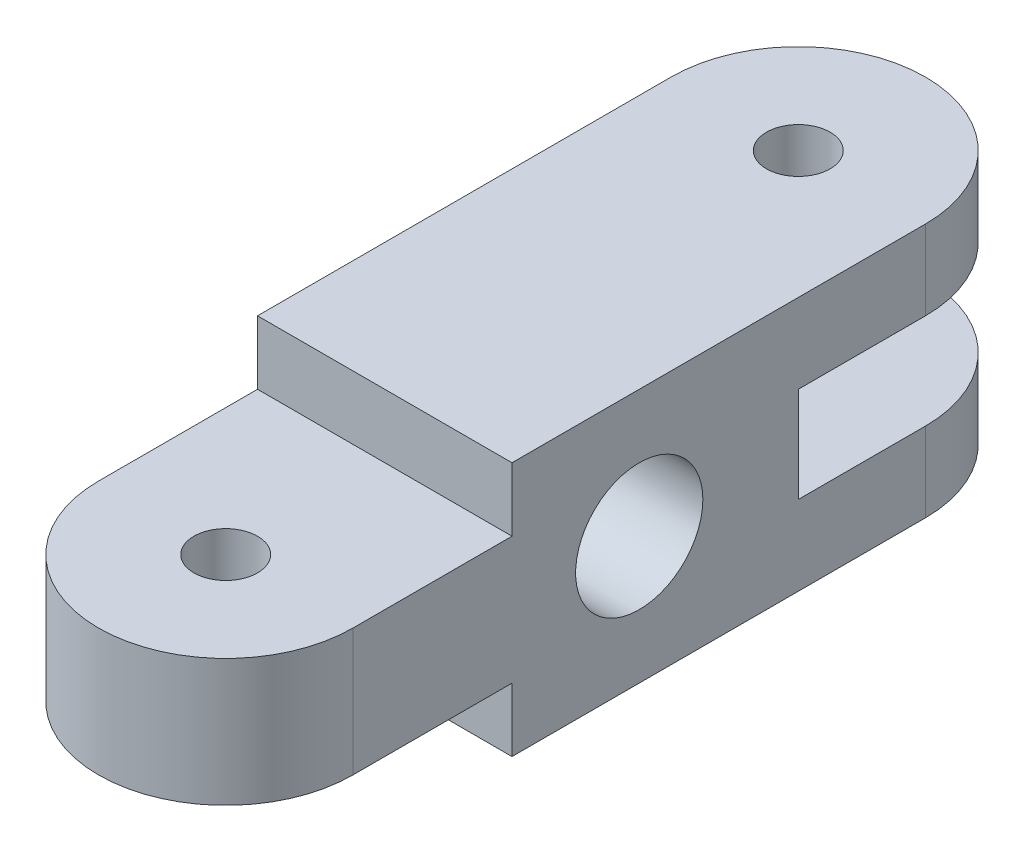
ISO-10303-21;
HEADER;
FILE_DESCRIPTION(('STEP AP214'),'2;1');
FILE_NAME('part.step','',(''),(''),'','','');
FILE_SCHEMA(('AUTOMOTIVE_DESIGN { 1 0 10303 214 1 1 1 1 }'));
ENDSEC;
DATA;
#1=APPLICATION_CONTEXT('core data for automotive mechanical design processes');
#2=APPLICATION_PROTOCOL_DEFINITION('international standard','automotive_design',2000,#1);
#3=PRODUCT_CONTEXT('',#1,'mechanical');
#4=PRODUCT('Part','Part','',(#3));
#5=PRODUCT_RELATED_PRODUCT_CATEGORY('part','',(#4));
#6=PRODUCT_DEFINITION_FORMATION('','',#4);
#7=PRODUCT_DEFINITION_CONTEXT('part definition',#1,'design');
#8=PRODUCT_DEFINITION('design','',#6,#7);
#9=PRODUCT_DEFINITION_SHAPE('','',#8);
#10=(LENGTH_UNIT() NAMED_UNIT(*) SI_UNIT(.MILLI.,.METRE.));
#11=(NAMED_UNIT(*) PLANE_ANGLE_UNIT() SI_UNIT($,.RADIAN.));
#12=(NAMED_UNIT(*) SI_UNIT($,.STERADIAN.) SOLID_ANGLE_UNIT());
#13=UNCERTAINTY_MEASURE_WITH_UNIT(LENGTH_MEASURE(1.E-05),#10,'distance_accuracy_value','');
#14=(GEOMETRIC_REPRESENTATION_CONTEXT(3) GLOBAL_UNCERTAINTY_ASSIGNED_CONTEXT((#13)) GLOBAL_UNIT_ASSIGNED_CONTEXT((#10,
#11,#12)) REPRESENTATION_CONTEXT('',''));
#15=CARTESIAN_POINT('',(0.,0.,0.));
#16=DIRECTION('',(0.,0.,1.));
#17=DIRECTION('',(1.,0.,0.));
#18=AXIS2_PLACEMENT_3D('',#15,#16,#17);
#19=CARTESIAN_POINT('',(12.7,-12.7,41.275));
#20=DIRECTION('',(-1.,0.,0.));
#21=DIRECTION('',(0.,0.,1.));
#22=AXIS2_PLACEMENT_3D('',#19,#20,#21);
#23=PLANE('',#22);
#24=CARTESIAN_POINT('',(12.7,0.,0.));
#25=DIRECTION('',(1.,0.,0.));
#26=DIRECTION('',(0.,0.,-1.));
#27=AXIS2_PLACEMENT_3D('',#24,#25,#26);
#28=CIRCLE('',#27,6.35);
#29=CARTESIAN_POINT('',(12.7,0.,-6.35));
#30=VERTEX_POINT('',#29);
#31=EDGE_CURVE('E158',#30,#30,#28,.T.);
#32=ORIENTED_EDGE('',*,*,#31,.F.);
#33=EDGE_LOOP('',(#32));
#34=FACE_BOUND('',#33,.T.);
#35=DIRECTION('',(0.,0.,-1.));
#36=VECTOR('',#35,1.);
#37=CARTESIAN_POINT('',(12.7,6.35,41.275));
#38=LINE('',#37,#36);
#39=CARTESIAN_POINT('',(12.7,6.35,28.575));
#40=VERTEX_POINT('',#39);
#41=CARTESIAN_POINT('',(12.7,6.35,12.7));
#42=VERTEX_POINT('',#41);
#43=EDGE_CURVE('E180',#40,#42,#38,.T.);
#44=ORIENTED_EDGE('',*,*,#43,.F.);
#45=DIRECTION('',(0.,1.,0.));
#46=VECTOR('',#45,1.);
#47=CARTESIAN_POINT('',(12.7,-12.7,28.575));
#48=LINE('',#47,#46);
#49=CARTESIAN_POINT('',(12.7,-6.35,28.575));
#50=VERTEX_POINT('',#49);
#51=EDGE_CURVE('E60',#50,#40,#48,.T.);
#52=ORIENTED_EDGE('',*,*,#51,.F.);
#53=DIRECTION('',(0.,0.,1.));
#54=VECTOR('',#53,1.);
#55=CARTESIAN_POINT('',(12.7,-6.35,41.275));
#56=LINE('',#55,#54);
#57=CARTESIAN_POINT('',(12.7,-6.35,12.7));
#58=VERTEX_POINT('',#57);
#59=EDGE_CURVE('E206',#58,#50,#56,.T.);
#60=ORIENTED_EDGE('',*,*,#59,.F.);
#61=DIRECTION('',(0.,1.,0.));
#62=VECTOR('',#61,1.);
#63=CARTESIAN_POINT('',(12.7,-12.7,12.7));
#64=LINE('',#63,#62);
#65=CARTESIAN_POINT('',(12.7,-12.7,12.7));
#66=VERTEX_POINT('',#65);
#67=EDGE_CURVE('E152',#66,#58,#64,.T.);
#68=ORIENTED_EDGE('',*,*,#67,.F.);
#69=DIRECTION('',(0.,0.,-1.));
#70=VECTOR('',#69,1.);
#71=CARTESIAN_POINT('',(12.7,-12.7,41.275));
#72=LINE('',#71,#70);
#73=CARTESIAN_POINT('',(12.7,-12.7,-28.575));
#74=VERTEX_POINT('',#73);
#75=EDGE_CURVE('E143',#66,#74,#72,.T.);
#76=ORIENTED_EDGE('',*,*,#75,.T.);
#77=DIRECTION('',(0.,1.,0.));
#78=VECTOR('',#77,1.);
#79=CARTESIAN_POINT('',(12.7,-12.7,-28.575));
#80=LINE('',#79,#78);
#81=CARTESIAN_POINT('',(12.7,-4.7625,-28.575));
#82=VERTEX_POINT('',#81);
#83=EDGE_CURVE('E125',#74,#82,#80,.T.);
#84=ORIENTED_EDGE('',*,*,#83,.T.);
#85=DIRECTION('',(0.,0.,-1.));
#86=VECTOR('',#85,1.);
#87=CARTESIAN_POINT('',(12.7,-4.7625,-41.275));
#88=LINE('',#87,#86);
#89=CARTESIAN_POINT('',(12.7,-4.7625,-15.875));
#90=VERTEX_POINT('',#89);
#91=EDGE_CURVE('E216',#90,#82,#88,.T.);
#92=ORIENTED_EDGE('',*,*,#91,.F.);
#93=DIRECTION('',(0.,-1.,0.));
#94=VECTOR('',#93,1.);
#95=CARTESIAN_POINT('',(12.7,4.7625,-15.875));
#96=LINE('',#95,#94);
#97=CARTESIAN_POINT('',(12.7,4.7625,-15.875));
#98=VERTEX_POINT('',#97);
#99=EDGE_CURVE('E225',#98,#90,#96,.T.);
#100=ORIENTED_EDGE('',*,*,#99,.F.);
#101=DIRECTION('',(0.,0.,1.));
#102=VECTOR('',#101,1.);
#103=CARTESIAN_POINT('',(12.7,4.7625,-41.275));
#104=LINE('',#103,#102);
#105=CARTESIAN_POINT('',(12.7,4.7625,-28.575));
#106=VERTEX_POINT('',#105);
#107=EDGE_CURVE('E223',#106,#98,#104,.T.);
#108=ORIENTED_EDGE('',*,*,#107,.F.);
#109=CARTESIAN_POINT('',(12.7,12.7,-28.575));
#110=VERTEX_POINT('',#109);
#111=EDGE_CURVE('E53',#106,#110,#80,.T.);
#112=ORIENTED_EDGE('',*,*,#111,.T.);
#113=DIRECTION('',(0.,0.,-1.));
#114=VECTOR('',#113,1.);
#115=CARTESIAN_POINT('',(12.7,12.7,41.275));
#116=LINE('',#115,#114);
#117=CARTESIAN_POINT('',(12.7,12.7,12.7));
#118=VERTEX_POINT('',#117);
#119=EDGE_CURVE('E164',#118,#110,#116,.T.);
#120=ORIENTED_EDGE('',*,*,#119,.F.);
#121=DIRECTION('',(0.,1.,0.));
#122=VECTOR('',#121,1.);
#123=CARTESIAN_POINT('',(12.7,12.7,12.7));
#124=LINE('',#123,#122);
#125=EDGE_CURVE('E187',#42,#118,#124,.T.);
#126=ORIENTED_EDGE('',*,*,#125,.F.);
#127=EDGE_LOOP('',(#44,#52,#60,#68,#76,#84,#92,#100,#108,#112,#120,#126));
#128=FACE_BOUND('',#127,.T.);
#129=ADVANCED_FACE('F39',(#34,#128),#23,.F.);
#130=CARTESIAN_POINT('',(-12.7,-12.7,41.275));
#131=DIRECTION('',(1.,0.,0.));
#132=DIRECTION('',(0.,0.,-1.));
#133=AXIS2_PLACEMENT_3D('',#130,#131,#132);
#134=PLANE('',#133);
#135=CARTESIAN_POINT('',(-12.7,0.,0.));
#136=DIRECTION('',(1.,0.,0.));
#137=DIRECTION('',(0.,0.,-1.));
#138=AXIS2_PLACEMENT_3D('',#135,#136,#137);
#139=CIRCLE('',#138,6.35);
#140=CARTESIAN_POINT('',(-12.7,0.,-6.35));
#141=VERTEX_POINT('',#140);
#142=EDGE_CURVE('E153',#141,#141,#139,.T.);
#143=ORIENTED_EDGE('',*,*,#142,.T.);
#144=EDGE_LOOP('',(#143));
#145=FACE_BOUND('',#144,.T.);
#146=DIRECTION('',(0.,1.,0.));
#147=VECTOR('',#146,1.);
#148=CARTESIAN_POINT('',(-12.7,-12.7,28.575));
#149=LINE('',#148,#147);
#150=CARTESIAN_POINT('',(-12.7,-6.35,28.575));
#151=VERTEX_POINT('',#150);
#152=CARTESIAN_POINT('',(-12.7,6.35,28.575));
#153=VERTEX_POINT('',#152);
#154=EDGE_CURVE('E270',#151,#153,#149,.T.);
#155=ORIENTED_EDGE('',*,*,#154,.T.);
#156=DIRECTION('',(0.,0.,-1.));
#157=VECTOR('',#156,1.);
#158=CARTESIAN_POINT('',(-12.7,6.35,41.275));
#159=LINE('',#158,#157);
#160=CARTESIAN_POINT('',(-12.7,6.35,12.7));
#161=VERTEX_POINT('',#160);
#162=EDGE_CURVE('E182',#153,#161,#159,.T.);
#163=ORIENTED_EDGE('',*,*,#162,.T.);
#164=DIRECTION('',(0.,1.,0.));
#165=VECTOR('',#164,1.);
#166=CARTESIAN_POINT('',(-12.7,12.7,12.7));
#167=LINE('',#166,#165);
#168=CARTESIAN_POINT('',(-12.7,12.7,12.7));
#169=VERTEX_POINT('',#168);
#170=EDGE_CURVE('E194',#161,#169,#167,.T.);
#171=ORIENTED_EDGE('',*,*,#170,.T.);
#172=DIRECTION('',(0.,0.,-1.));
#173=VECTOR('',#172,1.);
#174=CARTESIAN_POINT('',(-12.7,12.7,41.275));
#175=LINE('',#174,#173);
#176=CARTESIAN_POINT('',(-12.7,12.7,-28.575));
#177=VERTEX_POINT('',#176);
#178=EDGE_CURVE('E155',#169,#177,#175,.T.);
#179=ORIENTED_EDGE('',*,*,#178,.T.);
#180=DIRECTION('',(0.,1.,0.));
#181=VECTOR('',#180,1.);
#182=CARTESIAN_POINT('',(-12.7,-12.7,-28.575));
#183=LINE('',#182,#181);
#184=CARTESIAN_POINT('',(-12.7,4.7625,-28.575));
#185=VERTEX_POINT('',#184);
#186=EDGE_CURVE('E136',#185,#177,#183,.T.);
#187=ORIENTED_EDGE('',*,*,#186,.F.);
#188=DIRECTION('',(0.,0.,1.));
#189=VECTOR('',#188,1.);
#190=CARTESIAN_POINT('',(-12.7,4.7625,-41.275));
#191=LINE('',#190,#189);
#192=CARTESIAN_POINT('',(-12.7,4.7625,-15.875));
#193=VERTEX_POINT('',#192);
#194=EDGE_CURVE('E213',#185,#193,#191,.T.);
#195=ORIENTED_EDGE('',*,*,#194,.T.);
#196=DIRECTION('',(0.,-1.,0.));
#197=VECTOR('',#196,1.);
#198=CARTESIAN_POINT('',(-12.7,4.7625,-15.875));
#199=LINE('',#198,#197);
#200=CARTESIAN_POINT('',(-12.7,-4.7625,-15.875));
#201=VERTEX_POINT('',#200);
#202=EDGE_CURVE('E215',#193,#201,#199,.T.);
#203=ORIENTED_EDGE('',*,*,#202,.T.);
#204=DIRECTION('',(0.,0.,-1.));
#205=VECTOR('',#204,1.);
#206=CARTESIAN_POINT('',(-12.7,-4.7625,-41.275));
#207=LINE('',#206,#205);
#208=CARTESIAN_POINT('',(-12.7,-4.7625,-28.575));
#209=VERTEX_POINT('',#208);
#210=EDGE_CURVE('E219',#201,#209,#207,.T.);
#211=ORIENTED_EDGE('',*,*,#210,.T.);
#212=CARTESIAN_POINT('',(-12.7,-12.7,-28.575));
#213=VERTEX_POINT('',#212);
#214=EDGE_CURVE('E175',#213,#209,#183,.T.);
#215=ORIENTED_EDGE('',*,*,#214,.F.);
#216=DIRECTION('',(0.,0.,-1.));
#217=VECTOR('',#216,1.);
#218=CARTESIAN_POINT('',(-12.7,-12.7,41.275));
#219=LINE('',#218,#217);
#220=CARTESIAN_POINT('',(-12.7,-12.7,12.7));
#221=VERTEX_POINT('',#220);
#222=EDGE_CURVE('E145',#221,#213,#219,.T.);
#223=ORIENTED_EDGE('',*,*,#222,.F.);
#224=DIRECTION('',(0.,1.,0.));
#225=VECTOR('',#224,1.);
#226=CARTESIAN_POINT('',(-12.7,-12.7,12.7));
#227=LINE('',#226,#225);
#228=CARTESIAN_POINT('',(-12.7,-6.35,12.7));
#229=VERTEX_POINT('',#228);
#230=EDGE_CURVE('E202',#221,#229,#227,.T.);
#231=ORIENTED_EDGE('',*,*,#230,.T.);
#232=DIRECTION('',(0.,0.,1.));
#233=VECTOR('',#232,1.);
#234=CARTESIAN_POINT('',(-12.7,-6.35,41.275));
#235=LINE('',#234,#233);
#236=EDGE_CURVE('E205',#229,#151,#235,.T.);
#237=ORIENTED_EDGE('',*,*,#236,.T.);
#238=EDGE_LOOP('',(#155,#163,#171,#179,#187,#195,#203,#211,#215,#223,#231,#237));
#239=FACE_BOUND('',#238,.T.);
#240=ADVANCED_FACE('F243',(#145,#239),#134,.F.);
#241=CARTESIAN_POINT('',(-12.7,12.7,41.275));
#242=DIRECTION('',(0.,-1.,0.));
#243=DIRECTION('',(0.,0.,-1.));
#244=AXIS2_PLACEMENT_3D('',#241,#242,#243);
#245=PLANE('',#244);
#246=CARTESIAN_POINT('',(0.,12.7,-28.575));
#247=DIRECTION('',(0.,1.,0.));
#248=DIRECTION('',(0.,0.,1.));
#249=AXIS2_PLACEMENT_3D('',#246,#247,#248);
#250=CIRCLE('',#249,3.175);
#251=CARTESIAN_POINT('',(0.,12.7,-25.4));
#252=VERTEX_POINT('',#251);
#253=EDGE_CURVE('E259',#252,#252,#250,.T.);
#254=ORIENTED_EDGE('',*,*,#253,.F.);
#255=EDGE_LOOP('',(#254));
#256=FACE_BOUND('',#255,.T.);
#257=ORIENTED_EDGE('',*,*,#119,.T.);
#258=CARTESIAN_POINT('',(0.,12.7,-28.575));
#259=DIRECTION('',(0.,-1.,0.));
#260=DIRECTION('',(0.,0.,1.));
#261=AXIS2_PLACEMENT_3D('',#258,#259,#260);
#262=CIRCLE('',#261,12.7);
#263=EDGE_CURVE('E146',#177,#110,#262,.T.);
#264=ORIENTED_EDGE('',*,*,#263,.F.);
#265=ORIENTED_EDGE('',*,*,#178,.F.);
#266=DIRECTION('',(1.,0.,0.));
#267=VECTOR('',#266,1.);
#268=CARTESIAN_POINT('',(-12.7,12.7,12.7));
#269=LINE('',#268,#267);
#270=EDGE_CURVE('E197',#169,#118,#269,.T.);
#271=ORIENTED_EDGE('',*,*,#270,.T.);
#272=EDGE_LOOP('',(#257,#264,#265,#271));
#273=FACE_BOUND('',#272,.T.);
#274=ADVANCED_FACE('F251',(#256,#273),#245,.F.);
#275=CARTESIAN_POINT('',(-12.7,-12.7,41.275));
#276=DIRECTION('',(0.,1.,0.));
#277=DIRECTION('',(0.,0.,1.));
#278=AXIS2_PLACEMENT_3D('',#275,#276,#277);
#279=PLANE('',#278);
#280=CARTESIAN_POINT('',(0.,-12.7,-28.575));
#281=DIRECTION('',(0.,1.,0.));
#282=DIRECTION('',(0.,0.,1.));
#283=AXIS2_PLACEMENT_3D('',#280,#281,#282);
#284=CIRCLE('',#283,3.175);
#285=CARTESIAN_POINT('',(0.,-12.7,-25.4));
#286=VERTEX_POINT('',#285);
#287=EDGE_CURVE('E171',#286,#286,#284,.T.);
#288=ORIENTED_EDGE('',*,*,#287,.T.);
#289=EDGE_LOOP('',(#288));
#290=FACE_BOUND('',#289,.T.);
#291=ORIENTED_EDGE('',*,*,#222,.T.);
#292=CARTESIAN_POINT('',(0.,-12.7,-28.575));
#293=DIRECTION('',(0.,-1.,0.));
#294=DIRECTION('',(0.,0.,1.));
#295=AXIS2_PLACEMENT_3D('',#292,#293,#294);
#296=CIRCLE('',#295,12.7);
#297=EDGE_CURVE('E129',#213,#74,#296,.T.);
#298=ORIENTED_EDGE('',*,*,#297,.T.);
#299=ORIENTED_EDGE('',*,*,#75,.F.);
#300=DIRECTION('',(1.,0.,0.));
#301=VECTOR('',#300,1.);
#302=CARTESIAN_POINT('',(-12.7,-12.7,12.7));
#303=LINE('',#302,#301);
#304=EDGE_CURVE('E191',#221,#66,#303,.T.);
#305=ORIENTED_EDGE('',*,*,#304,.F.);
#306=EDGE_LOOP('',(#291,#298,#299,#305));
#307=FACE_BOUND('',#306,.T.);
#308=ADVANCED_FACE('F141',(#290,#307),#279,.F.);
#309=CARTESIAN_POINT('',(-12.7,0.,0.));
#310=DIRECTION('',(1.,0.,0.));
#311=DIRECTION('',(0.,0.,-1.));
#312=AXIS2_PLACEMENT_3D('',#309,#310,#311);
#313=CYLINDRICAL_SURFACE('',#312,6.35);
#314=CARTESIAN_POINT('',(-12.7,0.,-6.35));
#315=CARTESIAN_POINT('',(-12.4354166666667,0.,-6.35));
#316=CARTESIAN_POINT('',(-12.1708333333333,0.,-6.35));
#317=CARTESIAN_POINT('',(-11.6416666666667,0.,-6.35));
#318=CARTESIAN_POINT('',(-11.3770833333333,0.,-6.35));
#319=CARTESIAN_POINT('',(-10.8479166666667,0.,-6.35));
#320=CARTESIAN_POINT('',(-10.5833333333333,0.,-6.35));
#321=CARTESIAN_POINT('',(-10.0541666666667,0.,-6.35));
#322=CARTESIAN_POINT('',(-9.78958333333334,0.,-6.35));
#323=CARTESIAN_POINT('',(-9.26041666666667,0.,-6.35));
#324=CARTESIAN_POINT('',(-8.99583333333334,0.,-6.35));
#325=CARTESIAN_POINT('',(-8.46666666666667,0.,-6.35));
#326=CARTESIAN_POINT('',(-8.20208333333334,0.,-6.35));
#327=CARTESIAN_POINT('',(-7.67291666666667,0.,-6.35));
#328=CARTESIAN_POINT('',(-7.40833333333334,0.,-6.35));
#329=CARTESIAN_POINT('',(-6.87916666666667,0.,-6.35));
#330=CARTESIAN_POINT('',(-6.61458333333334,0.,-6.35));
#331=CARTESIAN_POINT('',(-6.08541666666667,0.,-6.35));
#332=CARTESIAN_POINT('',(-5.82083333333334,0.,-6.35));
#333=CARTESIAN_POINT('',(-5.29166666666667,0.,-6.35));
#334=CARTESIAN_POINT('',(-5.02708333333334,0.,-6.35));
#335=CARTESIAN_POINT('',(-4.49791666666667,0.,-6.35));
#336=CARTESIAN_POINT('',(-4.23333333333334,0.,-6.35));
#337=CARTESIAN_POINT('',(-3.70416666666667,0.,-6.35));
#338=CARTESIAN_POINT('',(-3.43958333333334,0.,-6.35));
#339=CARTESIAN_POINT('',(-2.91041666666667,0.,-6.35));
#340=CARTESIAN_POINT('',(-2.64583333333334,0.,-6.35));
#341=CARTESIAN_POINT('',(-2.11666666666667,0.,-6.35));
#342=CARTESIAN_POINT('',(-1.85208333333334,0.,-6.35));
#343=CARTESIAN_POINT('',(-1.32291666666667,0.,-6.35));
#344=CARTESIAN_POINT('',(-1.05833333333334,0.,-6.35));
#345=CARTESIAN_POINT('',(-0.529166666666671,0.,-6.35));
#346=CARTESIAN_POINT('',(-0.264583333333338,0.,-6.35));
#347=CARTESIAN_POINT('',(0.264583333333328,0.,-6.35));
#348=CARTESIAN_POINT('',(0.529166666666661,0.,-6.35));
#349=CARTESIAN_POINT('',(1.05833333333333,0.,-6.35));
#350=CARTESIAN_POINT('',(1.32291666666666,0.,-6.35));
#351=CARTESIAN_POINT('',(1.85208333333333,0.,-6.35));
#352=CARTESIAN_POINT('',(2.11666666666666,0.,-6.35));
#353=CARTESIAN_POINT('',(2.64583333333333,0.,-6.35));
#354=CARTESIAN_POINT('',(2.91041666666666,0.,-6.35));
#355=CARTESIAN_POINT('',(3.43958333333333,0.,-6.35));
#356=CARTESIAN_POINT('',(3.70416666666666,0.,-6.35));
#357=CARTESIAN_POINT('',(4.23333333333333,0.,-6.35));
#358=CARTESIAN_POINT('',(4.49791666666666,0.,-6.35));
#359=CARTESIAN_POINT('',(5.02708333333333,0.,-6.35));
#360=CARTESIAN_POINT('',(5.29166666666666,0.,-6.35));
#361=CARTESIAN_POINT('',(5.82083333333333,0.,-6.35));
#362=CARTESIAN_POINT('',(6.08541666666666,0.,-6.35));
#363=CARTESIAN_POINT('',(6.61458333333333,0.,-6.35));
#364=CARTESIAN_POINT('',(6.87916666666666,0.,-6.35));
#365=CARTESIAN_POINT('',(7.40833333333333,0.,-6.35));
#366=CARTESIAN_POINT('',(7.67291666666666,0.,-6.35));
#367=CARTESIAN_POINT('',(8.20208333333333,0.,-6.35));
#368=CARTESIAN_POINT('',(8.46666666666666,0.,-6.35));
#369=CARTESIAN_POINT('',(8.99583333333333,0.,-6.35));
#370=CARTESIAN_POINT('',(9.26041666666666,0.,-6.35));
#371=CARTESIAN_POINT('',(9.78958333333333,0.,-6.35));
#372=CARTESIAN_POINT('',(10.0541666666667,0.,-6.35));
#373=CARTESIAN_POINT('',(10.5833333333333,0.,-6.35));
#374=CARTESIAN_POINT('',(10.8479166666667,0.,-6.35));
#375=CARTESIAN_POINT('',(11.3770833333333,0.,-6.35));
#376=CARTESIAN_POINT('',(11.6416666666667,0.,-6.35));
#377=CARTESIAN_POINT('',(12.1708333333333,0.,-6.35));
#378=CARTESIAN_POINT('',(12.4354166666667,0.,-6.35));
#379=CARTESIAN_POINT('',(12.7,0.,-6.35));
#380=B_SPLINE_CURVE_WITH_KNOTS('',3,(#314,#315,#316,#317,#318,#319,#320,#321,#322,#323,#324,
#325,#326,#327,#328,#329,#330,#331,#332,#333,#334,#335,#336,#337,#338,#339,#340,#341,#342,#343,
#344,#345,#346,#347,#348,#349,#350,#351,#352,#353,#354,#355,#356,#357,#358,#359,#360,#361,#362,
#363,#364,#365,#366,#367,#368,#369,#370,#371,#372,#373,#374,#375,#376,#377,#378,#379),
.UNSPECIFIED.,.F.,.F.,(4,2,2,2,2,2,2,2,2,2,2,2,2,2,2,2,2,2,2,2,2,2,2,2,2,2,2,2,2,2,2,2,4),(0.,
0.793750000000001,1.5875,2.38125,3.175,3.96875,4.7625,5.55625,6.35,7.14375,7.9375,8.73125,9.525,
10.31875,11.1125,11.90625,12.7,13.49375,14.2875,15.08125,15.875,16.66875,17.4625,18.25625,19.05,
19.84375,20.6375,21.43125,22.225,23.01875,23.8125,24.60625,25.4),.UNSPECIFIED.);
#381=EDGE_CURVE('BSEAM300',#141,#30,#380,.T.);
#382=ORIENTED_EDGE('',*,*,#142,.F.);
#383=ORIENTED_EDGE('',*,*,#31,.T.);
#384=ORIENTED_EDGE('',*,*,#381,.T.);
#385=ORIENTED_EDGE('',*,*,#381,.F.);
#386=EDGE_LOOP('',(#382,#384,#383,#385));
#387=FACE_BOUND('',#386,.T.);
#388=ADVANCED_FACE('F300',(#387),#313,.F.);
#389=CARTESIAN_POINT('',(-12.7,-4.7625,-41.275));
#390=DIRECTION('',(0.,-1.,0.));
#391=DIRECTION('',(0.,0.,-1.));
#392=AXIS2_PLACEMENT_3D('',#389,#390,#391);
#393=PLANE('',#392);
#394=CARTESIAN_POINT('',(0.,-4.7625,-28.575));
#395=DIRECTION('',(0.,-1.,0.));
#396=DIRECTION('',(0.,0.,-1.));
#397=AXIS2_PLACEMENT_3D('',#394,#395,#396);
#398=CIRCLE('',#397,3.175);
#399=CARTESIAN_POINT('',(0.,-4.7625,-31.75));
#400=VERTEX_POINT('',#399);
#401=EDGE_CURVE('E170',#400,#400,#398,.T.);
#402=ORIENTED_EDGE('',*,*,#401,.T.);
#403=EDGE_LOOP('',(#402));
#404=FACE_BOUND('',#403,.T.);
#405=CARTESIAN_POINT('',(0.,-4.7625,-28.575));
#406=DIRECTION('',(0.,-1.,0.));
#407=DIRECTION('',(0.,0.,-1.));
#408=AXIS2_PLACEMENT_3D('',#405,#406,#407);
#409=CIRCLE('',#408,12.7);
#410=EDGE_CURVE('E131',#82,#209,#409,.F.);
#411=ORIENTED_EDGE('',*,*,#410,.T.);
#412=ORIENTED_EDGE('',*,*,#210,.F.);
#413=DIRECTION('',(1.,0.,0.));
#414=VECTOR('',#413,1.);
#415=CARTESIAN_POINT('',(-12.7,-4.7625,-15.875));
#416=LINE('',#415,#414);
#417=EDGE_CURVE('E210',#201,#90,#416,.T.);
#418=ORIENTED_EDGE('',*,*,#417,.T.);
#419=ORIENTED_EDGE('',*,*,#91,.T.);
#420=EDGE_LOOP('',(#411,#412,#418,#419));
#421=FACE_BOUND('',#420,.T.);
#422=ADVANCED_FACE('F240',(#404,#421),#393,.F.);
#423=CARTESIAN_POINT('',(-12.7,4.7625,-15.875));
#424=DIRECTION('',(0.,0.,1.));
#425=DIRECTION('',(1.,0.,0.));
#426=AXIS2_PLACEMENT_3D('',#423,#424,#425);
#427=PLANE('',#426);
#428=ORIENTED_EDGE('',*,*,#99,.T.);
#429=ORIENTED_EDGE('',*,*,#417,.F.);
#430=ORIENTED_EDGE('',*,*,#202,.F.);
#431=DIRECTION('',(1.,0.,0.));
#432=VECTOR('',#431,1.);
#433=CARTESIAN_POINT('',(-12.7,4.7625,-15.875));
#434=LINE('',#433,#432);
#435=EDGE_CURVE('E222',#193,#98,#434,.T.);
#436=ORIENTED_EDGE('',*,*,#435,.T.);
#437=EDGE_LOOP('',(#428,#429,#430,#436));
#438=FACE_BOUND('',#437,.T.);
#439=ADVANCED_FACE('F235',(#438),#427,.F.);
#440=CARTESIAN_POINT('',(-12.7,4.7625,-41.275));
#441=DIRECTION('',(0.,1.,0.));
#442=DIRECTION('',(0.,0.,1.));
#443=AXIS2_PLACEMENT_3D('',#440,#441,#442);
#444=PLANE('',#443);
#445=CARTESIAN_POINT('',(0.,4.7625,-28.575));
#446=DIRECTION('',(0.,1.,0.));
#447=DIRECTION('',(0.,0.,1.));
#448=AXIS2_PLACEMENT_3D('',#445,#446,#447);
#449=CIRCLE('',#448,3.175);
#450=CARTESIAN_POINT('',(0.,4.76249999999999,-25.4));
#451=VERTEX_POINT('',#450);
#452=EDGE_CURVE('E167',#451,#451,#449,.T.);
#453=ORIENTED_EDGE('',*,*,#452,.T.);
#454=EDGE_LOOP('',(#453));
#455=FACE_BOUND('',#454,.T.);
#456=ORIENTED_EDGE('',*,*,#194,.F.);
#457=CARTESIAN_POINT('',(0.,4.7625,-28.575));
#458=DIRECTION('',(0.,1.,0.));
#459=DIRECTION('',(0.,0.,1.));
#460=AXIS2_PLACEMENT_3D('',#457,#458,#459);
#461=CIRCLE('',#460,12.7);
#462=EDGE_CURVE('E11',#185,#106,#461,.F.);
#463=ORIENTED_EDGE('',*,*,#462,.T.);
#464=ORIENTED_EDGE('',*,*,#107,.T.);
#465=ORIENTED_EDGE('',*,*,#435,.F.);
#466=EDGE_LOOP('',(#456,#463,#464,#465));
#467=FACE_BOUND('',#466,.T.);
#468=ADVANCED_FACE('F245',(#455,#467),#444,.F.);
#469=CARTESIAN_POINT('',(-12.7,-6.35,41.275));
#470=DIRECTION('',(0.,1.,0.));
#471=DIRECTION('',(0.,0.,1.));
#472=AXIS2_PLACEMENT_3D('',#469,#470,#471);
#473=PLANE('',#472);
#474=CARTESIAN_POINT('',(0.,-6.35,28.575));
#475=DIRECTION('',(0.,1.,0.));
#476=DIRECTION('',(0.,0.,1.));
#477=AXIS2_PLACEMENT_3D('',#474,#475,#476);
#478=CIRCLE('',#477,3.175);
#479=CARTESIAN_POINT('',(0.,-6.35,31.75));
#480=VERTEX_POINT('',#479);
#481=EDGE_CURVE('E174',#480,#480,#478,.T.);
#482=ORIENTED_EDGE('',*,*,#481,.T.);
#483=EDGE_LOOP('',(#482));
#484=FACE_BOUND('',#483,.T.);
#485=ORIENTED_EDGE('',*,*,#59,.T.);
#486=CARTESIAN_POINT('',(0.,-6.35,28.575));
#487=DIRECTION('',(0.,1.,0.));
#488=DIRECTION('',(0.,0.,1.));
#489=AXIS2_PLACEMENT_3D('',#486,#487,#488);
#490=CIRCLE('',#489,12.7);
#491=EDGE_CURVE('E265',#50,#151,#490,.F.);
#492=ORIENTED_EDGE('',*,*,#491,.T.);
#493=ORIENTED_EDGE('',*,*,#236,.F.);
#494=DIRECTION('',(1.,0.,0.));
#495=VECTOR('',#494,1.);
#496=CARTESIAN_POINT('',(-12.7,-6.35,12.7));
#497=LINE('',#496,#495);
#498=EDGE_CURVE('E188',#229,#58,#497,.T.);
#499=ORIENTED_EDGE('',*,*,#498,.T.);
#500=EDGE_LOOP('',(#485,#492,#493,#499));
#501=FACE_BOUND('',#500,.T.);
#502=ADVANCED_FACE('F276',(#484,#501),#473,.F.);
#503=CARTESIAN_POINT('',(-12.7,-12.7,12.7));
#504=DIRECTION('',(0.,0.,-1.));
#505=DIRECTION('',(-1.,0.,0.));
#506=AXIS2_PLACEMENT_3D('',#503,#504,#505);
#507=PLANE('',#506);
#508=ORIENTED_EDGE('',*,*,#67,.T.);
#509=ORIENTED_EDGE('',*,*,#498,.F.);
#510=ORIENTED_EDGE('',*,*,#230,.F.);
#511=ORIENTED_EDGE('',*,*,#304,.T.);
#512=EDGE_LOOP('',(#508,#509,#510,#511));
#513=FACE_BOUND('',#512,.T.);
#514=ADVANCED_FACE('F274',(#513),#507,.F.);
#515=CARTESIAN_POINT('',(-12.7,12.7,12.7));
#516=DIRECTION('',(0.,0.,-1.));
#517=DIRECTION('',(-1.,0.,0.));
#518=AXIS2_PLACEMENT_3D('',#515,#516,#517);
#519=PLANE('',#518);
#520=ORIENTED_EDGE('',*,*,#125,.T.);
#521=ORIENTED_EDGE('',*,*,#270,.F.);
#522=ORIENTED_EDGE('',*,*,#170,.F.);
#523=DIRECTION('',(1.,0.,0.));
#524=VECTOR('',#523,1.);
#525=CARTESIAN_POINT('',(-12.7,6.35,12.7));
#526=LINE('',#525,#524);
#527=EDGE_CURVE('E200',#161,#42,#526,.T.);
#528=ORIENTED_EDGE('',*,*,#527,.T.);
#529=EDGE_LOOP('',(#520,#521,#522,#528));
#530=FACE_BOUND('',#529,.T.);
#531=ADVANCED_FACE('F338',(#530),#519,.F.);
#532=CARTESIAN_POINT('',(-12.7,6.35,41.275));
#533=DIRECTION('',(0.,-1.,0.));
#534=DIRECTION('',(0.,0.,-1.));
#535=AXIS2_PLACEMENT_3D('',#532,#533,#534);
#536=PLANE('',#535);
#537=CARTESIAN_POINT('',(0.,6.35,28.575));
#538=DIRECTION('',(0.,-1.,0.));
#539=DIRECTION('',(0.,0.,-1.));
#540=AXIS2_PLACEMENT_3D('',#537,#538,#539);
#541=CIRCLE('',#540,3.175);
#542=CARTESIAN_POINT('',(0.,6.35,31.75));
#543=VERTEX_POINT('',#542);
#544=EDGE_CURVE('E172',#543,#543,#541,.T.);
#545=ORIENTED_EDGE('',*,*,#544,.T.);
#546=EDGE_LOOP('',(#545));
#547=FACE_BOUND('',#546,.T.);
#548=ORIENTED_EDGE('',*,*,#162,.F.);
#549=CARTESIAN_POINT('',(0.,6.35,28.575));
#550=DIRECTION('',(0.,-1.,0.));
#551=DIRECTION('',(0.,0.,-1.));
#552=AXIS2_PLACEMENT_3D('',#549,#550,#551);
#553=CIRCLE('',#552,12.7);
#554=EDGE_CURVE('E46',#153,#40,#553,.F.);
#555=ORIENTED_EDGE('',*,*,#554,.T.);
#556=ORIENTED_EDGE('',*,*,#43,.T.);
#557=ORIENTED_EDGE('',*,*,#527,.F.);
#558=EDGE_LOOP('',(#548,#555,#556,#557));
#559=FACE_BOUND('',#558,.T.);
#560=ADVANCED_FACE('F178',(#547,#559),#536,.F.);
#561=CARTESIAN_POINT('',(0.,-12.7,-28.575));
#562=DIRECTION('',(0.,1.,0.));
#563=DIRECTION('',(0.,0.,1.));
#564=AXIS2_PLACEMENT_3D('',#561,#562,#563);
#565=CYLINDRICAL_SURFACE('',#564,3.175);
#566=ORIENTED_EDGE('',*,*,#253,.T.);
#567=EDGE_LOOP('',(#566));
#568=FACE_BOUND('',#567,.T.);
#569=ORIENTED_EDGE('',*,*,#452,.F.);
#570=EDGE_LOOP('',(#569));
#571=FACE_BOUND('',#570,.T.);
#572=ADVANCED_FACE('F322',(#568,#571),#565,.F.);
#573=ORIENTED_EDGE('',*,*,#287,.F.);
#574=EDGE_LOOP('',(#573));
#575=FACE_BOUND('',#574,.T.);
#576=ORIENTED_EDGE('',*,*,#401,.F.);
#577=EDGE_LOOP('',(#576));
#578=FACE_BOUND('',#577,.T.);
#579=ADVANCED_FACE('F286',(#575,#578),#565,.F.);
#580=CARTESIAN_POINT('',(0.,-12.7,28.575));
#581=DIRECTION('',(0.,1.,0.));
#582=DIRECTION('',(0.,0.,1.));
#583=AXIS2_PLACEMENT_3D('',#580,#581,#582);
#584=CYLINDRICAL_SURFACE('',#583,3.175);
#585=CARTESIAN_POINT('',(0.,6.35,31.75));
#586=CARTESIAN_POINT('',(0.,6.21770833333333,31.75));
#587=CARTESIAN_POINT('',(0.,6.08541666666666,31.75));
#588=CARTESIAN_POINT('',(0.,5.82083333333333,31.75));
#589=CARTESIAN_POINT('',(0.,5.68854166666666,31.75));
#590=CARTESIAN_POINT('',(0.,5.42395833333333,31.75));
#591=CARTESIAN_POINT('',(0.,5.29166666666666,31.75));
#592=CARTESIAN_POINT('',(0.,5.02708333333333,31.75));
#593=CARTESIAN_POINT('',(0.,4.89479166666667,31.75));
#594=CARTESIAN_POINT('',(0.,4.63020833333333,31.75));
#595=CARTESIAN_POINT('',(0.,4.49791666666667,31.75));
#596=CARTESIAN_POINT('',(0.,4.23333333333333,31.75));
#597=CARTESIAN_POINT('',(0.,4.10104166666666,31.75));
#598=CARTESIAN_POINT('',(0.,3.83645833333333,31.75));
#599=CARTESIAN_POINT('',(0.,3.70416666666666,31.75));
#600=CARTESIAN_POINT('',(0.,3.43958333333333,31.75));
#601=CARTESIAN_POINT('',(0.,3.30729166666666,31.75));
#602=CARTESIAN_POINT('',(0.,3.04270833333333,31.75));
#603=CARTESIAN_POINT('',(0.,2.91041666666667,31.75));
#604=CARTESIAN_POINT('',(0.,2.64583333333333,31.75));
#605=CARTESIAN_POINT('',(0.,2.51354166666667,31.75));
#606=CARTESIAN_POINT('',(0.,2.24895833333333,31.75));
#607=CARTESIAN_POINT('',(0.,2.11666666666667,31.75));
#608=CARTESIAN_POINT('',(0.,1.85208333333333,31.75));
#609=CARTESIAN_POINT('',(0.,1.71979166666667,31.75));
#610=CARTESIAN_POINT('',(0.,1.45520833333333,31.75));
#611=CARTESIAN_POINT('',(0.,1.32291666666667,31.75));
#612=CARTESIAN_POINT('',(0.,1.05833333333333,31.75));
#613=CARTESIAN_POINT('',(0.,0.926041666666666,31.75));
#614=CARTESIAN_POINT('',(0.,0.661458333333332,31.75));
#615=CARTESIAN_POINT('',(0.,0.529166666666665,31.75));
#616=CARTESIAN_POINT('',(0.,0.264583333333332,31.75));
#617=CARTESIAN_POINT('',(0.,0.132291666666666,31.75));
#618=CARTESIAN_POINT('',(0.,-0.132291666666667,31.75));
#619=CARTESIAN_POINT('',(0.,-0.264583333333334,31.75));
#620=CARTESIAN_POINT('',(0.,-0.529166666666668,31.75));
#621=CARTESIAN_POINT('',(0.,-0.661458333333334,31.75));
#622=CARTESIAN_POINT('',(0.,-0.926041666666668,31.75));
#623=CARTESIAN_POINT('',(0.,-1.05833333333333,31.75));
#624=CARTESIAN_POINT('',(0.,-1.32291666666667,31.75));
#625=CARTESIAN_POINT('',(0.,-1.45520833333333,31.75));
#626=CARTESIAN_POINT('',(0.,-1.71979166666667,31.75));
#627=CARTESIAN_POINT('',(0.,-1.85208333333333,31.75));
#628=CARTESIAN_POINT('',(0.,-2.11666666666667,31.75));
#629=CARTESIAN_POINT('',(0.,-2.24895833333333,31.75));
#630=CARTESIAN_POINT('',(0.,-2.51354166666667,31.75));
#631=CARTESIAN_POINT('',(0.,-2.64583333333333,31.75));
#632=CARTESIAN_POINT('',(0.,-2.91041666666667,31.75));
#633=CARTESIAN_POINT('',(0.,-3.04270833333333,31.75));
#634=CARTESIAN_POINT('',(0.,-3.30729166666667,31.75));
#635=CARTESIAN_POINT('',(0.,-3.43958333333333,31.75));
#636=CARTESIAN_POINT('',(0.,-3.70416666666667,31.75));
#637=CARTESIAN_POINT('',(0.,-3.83645833333333,31.75));
#638=CARTESIAN_POINT('',(0.,-4.10104166666667,31.75));
#639=CARTESIAN_POINT('',(0.,-4.23333333333333,31.75));
#640=CARTESIAN_POINT('',(0.,-4.49791666666667,31.75));
#641=CARTESIAN_POINT('',(0.,-4.63020833333333,31.75));
#642=CARTESIAN_POINT('',(0.,-4.89479166666667,31.75));
#643=CARTESIAN_POINT('',(0.,-5.02708333333333,31.75));
#644=CARTESIAN_POINT('',(0.,-5.29166666666667,31.75));
#645=CARTESIAN_POINT('',(0.,-5.42395833333333,31.75));
#646=CARTESIAN_POINT('',(0.,-5.68854166666667,31.75));
#647=CARTESIAN_POINT('',(0.,-5.82083333333333,31.75));
#648=CARTESIAN_POINT('',(0.,-6.08541666666667,31.75));
#649=CARTESIAN_POINT('',(0.,-6.21770833333333,31.75));
#650=CARTESIAN_POINT('',(0.,-6.35,31.75));
#651=B_SPLINE_CURVE_WITH_KNOTS('',3,(#585,#586,#587,#588,#589,#590,#591,#592,#593,#594,#595,
#596,#597,#598,#599,#600,#601,#602,#603,#604,#605,#606,#607,#608,#609,#610,#611,#612,#613,#614,
#615,#616,#617,#618,#619,#620,#621,#622,#623,#624,#625,#626,#627,#628,#629,#630,#631,#632,#633,
#634,#635,#636,#637,#638,#639,#640,#641,#642,#643,#644,#645,#646,#647,#648,#649,#650),
.UNSPECIFIED.,.F.,.F.,(4,2,2,2,2,2,2,2,2,2,2,2,2,2,2,2,2,2,2,2,2,2,2,2,2,2,2,2,2,2,2,2,4),(0.,
0.396875000000001,0.793749999999999,1.190625,1.5875,1.984375,2.38125,2.778125,3.175,3.571875,
3.96875,4.365625,4.7625,5.159375,5.55625,5.953125,6.35,6.746875,7.14375,7.540625,7.9375,
8.334375,8.73125,9.128125,9.525,9.921875,10.31875,10.715625,11.1125,11.509375,11.90625,
12.303125,12.7),.UNSPECIFIED.);
#652=EDGE_CURVE('BSEAM279',#543,#480,#651,.T.);
#653=ORIENTED_EDGE('',*,*,#544,.F.);
#654=ORIENTED_EDGE('',*,*,#481,.F.);
#655=ORIENTED_EDGE('',*,*,#652,.T.);
#656=ORIENTED_EDGE('',*,*,#652,.F.);
#657=EDGE_LOOP('',(#653,#655,#654,#656));
#658=FACE_BOUND('',#657,.T.);
#659=ADVANCED_FACE('F279',(#658),#584,.F.);
#660=CARTESIAN_POINT('',(0.,-12.7,28.575));
#661=DIRECTION('',(0.,1.,0.));
#662=DIRECTION('',(0.,0.,1.));
#663=AXIS2_PLACEMENT_3D('',#660,#661,#662);
#664=CYLINDRICAL_SURFACE('',#663,12.7);
#665=ORIENTED_EDGE('',*,*,#554,.F.);
#666=ORIENTED_EDGE('',*,*,#154,.F.);
#667=ORIENTED_EDGE('',*,*,#491,.F.);
#668=ORIENTED_EDGE('',*,*,#51,.T.);
#669=EDGE_LOOP('',(#665,#666,#667,#668));
#670=FACE_BOUND('',#669,.T.);
#671=ADVANCED_FACE('F277',(#670),#664,.T.);
#672=CARTESIAN_POINT('',(0.,-12.7,-28.575));
#673=DIRECTION('',(0.,1.,0.));
#674=DIRECTION('',(0.,0.,1.));
#675=AXIS2_PLACEMENT_3D('',#672,#673,#674);
#676=CYLINDRICAL_SURFACE('',#675,12.7);
#677=ORIENTED_EDGE('',*,*,#263,.T.);
#678=ORIENTED_EDGE('',*,*,#111,.F.);
#679=ORIENTED_EDGE('',*,*,#462,.F.);
#680=ORIENTED_EDGE('',*,*,#186,.T.);
#681=EDGE_LOOP('',(#677,#678,#679,#680));
#682=FACE_BOUND('',#681,.T.);
#683=ADVANCED_FACE('F246',(#682),#676,.T.);
#684=ORIENTED_EDGE('',*,*,#410,.F.);
#685=ORIENTED_EDGE('',*,*,#83,.F.);
#686=ORIENTED_EDGE('',*,*,#297,.F.);
#687=ORIENTED_EDGE('',*,*,#214,.T.);
#688=EDGE_LOOP('',(#684,#685,#686,#687));
#689=FACE_BOUND('',#688,.T.);
#690=ADVANCED_FACE('F127',(#689),#676,.T.);
#691=CLOSED_SHELL('',(#129,#240,#274,#308,#388,#422,#439,#468,#502,#514,#531,#560,#572,#579,
#659,#671,#683,#690));
#692=MANIFOLD_SOLID_BREP('B2',#691);
#693=ADVANCED_BREP_SHAPE_REPRESENTATION('',(#18,#692),#14);
#694=SHAPE_DEFINITION_REPRESENTATION(#9,#693);
ENDSEC;
END-ISO-10303-21;
